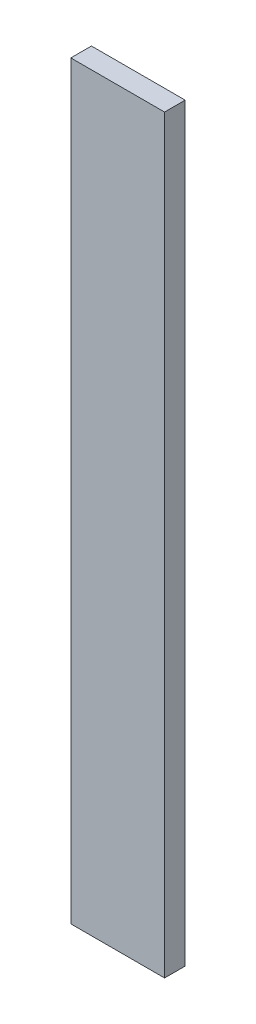
ISO-10303-21;
HEADER;
FILE_DESCRIPTION(('STEP AP214'),'2;1');
FILE_NAME('part.step','',(''),(''),'','','');
FILE_SCHEMA(('AUTOMOTIVE_DESIGN { 1 0 10303 214 1 1 1 1 }'));
ENDSEC;
DATA;
#1=APPLICATION_CONTEXT('core data for automotive mechanical design processes');
#2=APPLICATION_PROTOCOL_DEFINITION('international standard','automotive_design',2000,#1);
#3=PRODUCT_CONTEXT('',#1,'mechanical');
#4=PRODUCT('Part','Part','',(#3));
#5=PRODUCT_RELATED_PRODUCT_CATEGORY('part','',(#4));
#6=PRODUCT_DEFINITION_FORMATION('','',#4);
#7=PRODUCT_DEFINITION_CONTEXT('part definition',#1,'design');
#8=PRODUCT_DEFINITION('design','',#6,#7);
#9=PRODUCT_DEFINITION_SHAPE('','',#8);
#10=(LENGTH_UNIT() NAMED_UNIT(*) SI_UNIT(.MILLI.,.METRE.));
#11=(NAMED_UNIT(*) PLANE_ANGLE_UNIT() SI_UNIT($,.RADIAN.));
#12=(NAMED_UNIT(*) SI_UNIT($,.STERADIAN.) SOLID_ANGLE_UNIT());
#13=UNCERTAINTY_MEASURE_WITH_UNIT(LENGTH_MEASURE(1.E-05),#10,'distance_accuracy_value','');
#14=(GEOMETRIC_REPRESENTATION_CONTEXT(3) GLOBAL_UNCERTAINTY_ASSIGNED_CONTEXT((#13)) GLOBAL_UNIT_ASSIGNED_CONTEXT((#10,
#11,#12)) REPRESENTATION_CONTEXT('',''));
#15=CARTESIAN_POINT('',(0.,0.,0.));
#16=DIRECTION('',(0.,0.,1.));
#17=DIRECTION('',(1.,0.,0.));
#18=AXIS2_PLACEMENT_3D('',#15,#16,#17);
#19=CARTESIAN_POINT('',(-50.,400.,22.));
#20=DIRECTION('',(1.,0.,0.));
#21=DIRECTION('',(0.,1.,0.));
#22=AXIS2_PLACEMENT_3D('',#19,#20,#21);
#23=PLANE('',#22);
#24=DIRECTION('',(0.,-1.,0.));
#25=VECTOR('',#24,1.);
#26=CARTESIAN_POINT('',(-50.,400.,0.));
#27=LINE('',#26,#25);
#28=CARTESIAN_POINT('',(-50.,400.,0.));
#29=VERTEX_POINT('',#28);
#30=CARTESIAN_POINT('',(-50.,-400.,0.));
#31=VERTEX_POINT('',#30);
#32=EDGE_CURVE('E81',#29,#31,#27,.T.);
#33=ORIENTED_EDGE('',*,*,#32,.T.);
#34=DIRECTION('',(0.,0.,-1.));
#35=VECTOR('',#34,1.);
#36=CARTESIAN_POINT('',(-50.,-400.,22.));
#37=LINE('',#36,#35);
#38=CARTESIAN_POINT('',(-50.,-400.,22.));
#39=VERTEX_POINT('',#38);
#40=EDGE_CURVE('E10',#39,#31,#37,.T.);
#41=ORIENTED_EDGE('',*,*,#40,.F.);
#42=DIRECTION('',(0.,-1.,0.));
#43=VECTOR('',#42,1.);
#44=CARTESIAN_POINT('',(-50.,400.,22.));
#45=LINE('',#44,#43);
#46=CARTESIAN_POINT('',(-50.,400.,22.));
#47=VERTEX_POINT('',#46);
#48=EDGE_CURVE('E67',#47,#39,#45,.T.);
#49=ORIENTED_EDGE('',*,*,#48,.F.);
#50=DIRECTION('',(0.,0.,-1.));
#51=VECTOR('',#50,1.);
#52=CARTESIAN_POINT('',(-50.,400.,22.));
#53=LINE('',#52,#51);
#54=EDGE_CURVE('E75',#47,#29,#53,.T.);
#55=ORIENTED_EDGE('',*,*,#54,.T.);
#56=EDGE_LOOP('',(#33,#41,#49,#55));
#57=FACE_BOUND('',#56,.T.);
#58=ADVANCED_FACE('F16',(#57),#23,.F.);
#59=CARTESIAN_POINT('',(-50.,-400.,22.));
#60=DIRECTION('',(0.,1.,0.));
#61=DIRECTION('',(0.,0.,1.));
#62=AXIS2_PLACEMENT_3D('',#59,#60,#61);
#63=PLANE('',#62);
#64=DIRECTION('',(1.,0.,0.));
#65=VECTOR('',#64,1.);
#66=CARTESIAN_POINT('',(-50.,-400.,0.));
#67=LINE('',#66,#65);
#68=CARTESIAN_POINT('',(50.,-400.,0.));
#69=VERTEX_POINT('',#68);
#70=EDGE_CURVE('E71',#31,#69,#67,.T.);
#71=ORIENTED_EDGE('',*,*,#70,.T.);
#72=DIRECTION('',(0.,0.,-1.));
#73=VECTOR('',#72,1.);
#74=CARTESIAN_POINT('',(50.,-400.,22.));
#75=LINE('',#74,#73);
#76=CARTESIAN_POINT('',(50.,-400.,22.));
#77=VERTEX_POINT('',#76);
#78=EDGE_CURVE('E24',#77,#69,#75,.T.);
#79=ORIENTED_EDGE('',*,*,#78,.F.);
#80=DIRECTION('',(1.,0.,0.));
#81=VECTOR('',#80,1.);
#82=CARTESIAN_POINT('',(-50.,-400.,22.));
#83=LINE('',#82,#81);
#84=EDGE_CURVE('E62',#39,#77,#83,.T.);
#85=ORIENTED_EDGE('',*,*,#84,.F.);
#86=ORIENTED_EDGE('',*,*,#40,.T.);
#87=EDGE_LOOP('',(#71,#79,#85,#86));
#88=FACE_BOUND('',#87,.T.);
#89=ADVANCED_FACE('F70',(#88),#63,.F.);
#90=CARTESIAN_POINT('',(50.,-400.,22.));
#91=DIRECTION('',(-1.,0.,0.));
#92=DIRECTION('',(0.,0.,1.));
#93=AXIS2_PLACEMENT_3D('',#90,#91,#92);
#94=PLANE('',#93);
#95=DIRECTION('',(0.,1.,0.));
#96=VECTOR('',#95,1.);
#97=CARTESIAN_POINT('',(50.,-400.,0.));
#98=LINE('',#97,#96);
#99=CARTESIAN_POINT('',(50.,400.,0.));
#100=VERTEX_POINT('',#99);
#101=EDGE_CURVE('E49',#69,#100,#98,.T.);
#102=ORIENTED_EDGE('',*,*,#101,.T.);
#103=DIRECTION('',(0.,0.,-1.));
#104=VECTOR('',#103,1.);
#105=CARTESIAN_POINT('',(50.,400.,22.));
#106=LINE('',#105,#104);
#107=CARTESIAN_POINT('',(50.,400.,22.));
#108=VERTEX_POINT('',#107);
#109=EDGE_CURVE('E72',#108,#100,#106,.T.);
#110=ORIENTED_EDGE('',*,*,#109,.F.);
#111=DIRECTION('',(0.,1.,0.));
#112=VECTOR('',#111,1.);
#113=CARTESIAN_POINT('',(50.,-400.,22.));
#114=LINE('',#113,#112);
#115=EDGE_CURVE('E65',#77,#108,#114,.T.);
#116=ORIENTED_EDGE('',*,*,#115,.F.);
#117=ORIENTED_EDGE('',*,*,#78,.T.);
#118=EDGE_LOOP('',(#102,#110,#116,#117));
#119=FACE_BOUND('',#118,.T.);
#120=ADVANCED_FACE('F73',(#119),#94,.F.);
#121=CARTESIAN_POINT('',(50.,400.,22.));
#122=DIRECTION('',(0.,-1.,0.));
#123=DIRECTION('',(0.,0.,-1.));
#124=AXIS2_PLACEMENT_3D('',#121,#122,#123);
#125=PLANE('',#124);
#126=DIRECTION('',(-1.,0.,0.));
#127=VECTOR('',#126,1.);
#128=CARTESIAN_POINT('',(50.,400.,0.));
#129=LINE('',#128,#127);
#130=EDGE_CURVE('E55',#100,#29,#129,.T.);
#131=ORIENTED_EDGE('',*,*,#130,.T.);
#132=ORIENTED_EDGE('',*,*,#54,.F.);
#133=DIRECTION('',(-1.,0.,0.));
#134=VECTOR('',#133,1.);
#135=CARTESIAN_POINT('',(50.,400.,22.));
#136=LINE('',#135,#134);
#137=EDGE_CURVE('E32',#108,#47,#136,.T.);
#138=ORIENTED_EDGE('',*,*,#137,.F.);
#139=ORIENTED_EDGE('',*,*,#109,.T.);
#140=EDGE_LOOP('',(#131,#132,#138,#139));
#141=FACE_BOUND('',#140,.T.);
#142=ADVANCED_FACE('F90',(#141),#125,.F.);
#143=CARTESIAN_POINT('',(-50.,-400.,22.));
#144=DIRECTION('',(0.,0.,1.));
#145=DIRECTION('',(1.,0.,0.));
#146=AXIS2_PLACEMENT_3D('',#143,#144,#145);
#147=PLANE('',#146);
#148=ORIENTED_EDGE('',*,*,#48,.T.);
#149=ORIENTED_EDGE('',*,*,#84,.T.);
#150=ORIENTED_EDGE('',*,*,#115,.T.);
#151=ORIENTED_EDGE('',*,*,#137,.T.);
#152=EDGE_LOOP('',(#148,#149,#150,#151));
#153=FACE_BOUND('',#152,.T.);
#154=ADVANCED_FACE('F63',(#153),#147,.T.);
#155=CARTESIAN_POINT('',(-50.,-400.,0.));
#156=DIRECTION('',(0.,0.,1.));
#157=DIRECTION('',(1.,0.,0.));
#158=AXIS2_PLACEMENT_3D('',#155,#156,#157);
#159=PLANE('',#158);
#160=ORIENTED_EDGE('',*,*,#32,.F.);
#161=ORIENTED_EDGE('',*,*,#130,.F.);
#162=ORIENTED_EDGE('',*,*,#101,.F.);
#163=ORIENTED_EDGE('',*,*,#70,.F.);
#164=EDGE_LOOP('',(#160,#161,#162,#163));
#165=FACE_BOUND('',#164,.T.);
#166=ADVANCED_FACE('F93',(#165),#159,.F.);
#167=CLOSED_SHELL('',(#58,#89,#120,#142,#154,#166));
#168=MANIFOLD_SOLID_BREP('B1',#167);
#169=ADVANCED_BREP_SHAPE_REPRESENTATION('',(#18,#168),#14);
#170=SHAPE_DEFINITION_REPRESENTATION(#9,#169);
ENDSEC;
END-ISO-10303-21;
